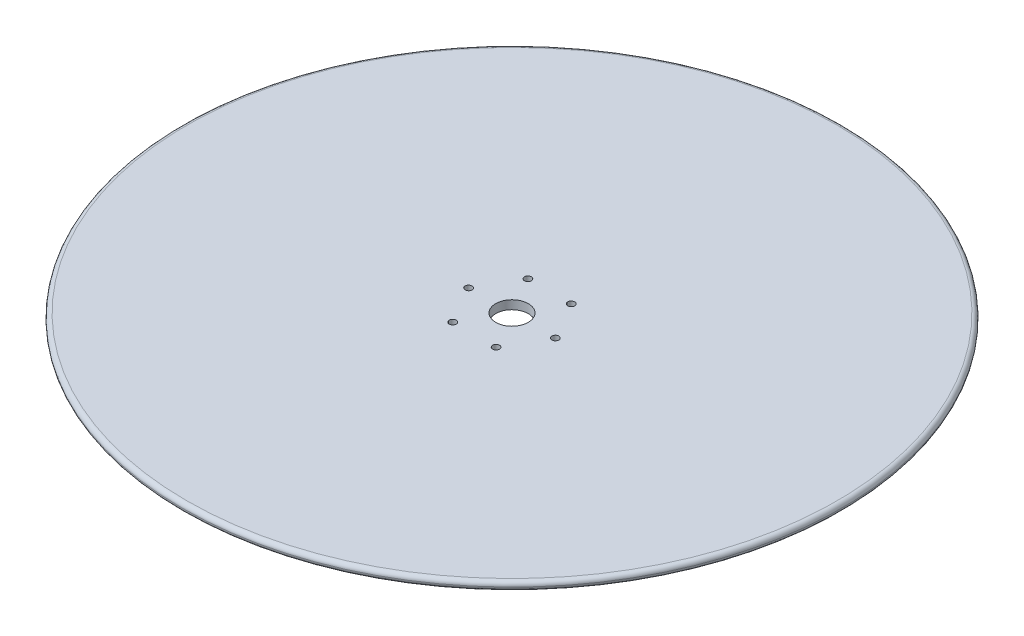
ISO-10303-21;
HEADER;
FILE_DESCRIPTION(('STEP AP214'),'2;1');
FILE_NAME('part.step','',(''),(''),'','','');
FILE_SCHEMA(('AUTOMOTIVE_DESIGN { 1 0 10303 214 1 1 1 1 }'));
ENDSEC;
DATA;
#1=APPLICATION_CONTEXT('core data for automotive mechanical design processes');
#2=APPLICATION_PROTOCOL_DEFINITION('international standard','automotive_design',2000,#1);
#3=PRODUCT_CONTEXT('',#1,'mechanical');
#4=PRODUCT('Part','Part','',(#3));
#5=PRODUCT_RELATED_PRODUCT_CATEGORY('part','',(#4));
#6=PRODUCT_DEFINITION_FORMATION('','',#4);
#7=PRODUCT_DEFINITION_CONTEXT('part definition',#1,'design');
#8=PRODUCT_DEFINITION('design','',#6,#7);
#9=PRODUCT_DEFINITION_SHAPE('','',#8);
#10=(LENGTH_UNIT() NAMED_UNIT(*) SI_UNIT(.MILLI.,.METRE.));
#11=(NAMED_UNIT(*) PLANE_ANGLE_UNIT() SI_UNIT($,.RADIAN.));
#12=(NAMED_UNIT(*) SI_UNIT($,.STERADIAN.) SOLID_ANGLE_UNIT());
#13=UNCERTAINTY_MEASURE_WITH_UNIT(LENGTH_MEASURE(1.E-05),#10,'distance_accuracy_value','');
#14=(GEOMETRIC_REPRESENTATION_CONTEXT(3) GLOBAL_UNCERTAINTY_ASSIGNED_CONTEXT((#13)) GLOBAL_UNIT_ASSIGNED_CONTEXT((#10,
#11,#12)) REPRESENTATION_CONTEXT('',''));
#15=CARTESIAN_POINT('',(0.,0.,0.));
#16=DIRECTION('',(0.,0.,1.));
#17=DIRECTION('',(1.,0.,0.));
#18=AXIS2_PLACEMENT_3D('',#15,#16,#17);
#19=CARTESIAN_POINT('',(0.,10.,0.));
#20=DIRECTION('',(0.,1.,0.));
#21=DIRECTION('',(0.,0.,1.));
#22=AXIS2_PLACEMENT_3D('',#19,#20,#21);
#23=PLANE('',#22);
#24=CARTESIAN_POINT('',(0.,10.,0.));
#25=DIRECTION('',(0.,1.,0.));
#26=DIRECTION('',(0.,0.,1.));
#27=AXIS2_PLACEMENT_3D('',#24,#25,#26);
#28=CIRCLE('',#27,375.);
#29=CARTESIAN_POINT('',(0.,10.,375.));
#30=VERTEX_POINT('',#29);
#31=EDGE_CURVE('E10',#30,#30,#28,.T.);
#32=ORIENTED_EDGE('',*,*,#31,.T.);
#33=EDGE_LOOP('',(#32));
#34=FACE_BOUND('',#33,.T.);
#35=CARTESIAN_POINT('',(24.9999999999995,10.,43.3012701892223));
#36=DIRECTION('',(0.,1.,0.));
#37=DIRECTION('',(0.,0.,1.));
#38=AXIS2_PLACEMENT_3D('',#35,#36,#37);
#39=CIRCLE('',#38,4.00000000000001);
#40=CARTESIAN_POINT('',(24.9999999999995,10.,47.3012701892223));
#41=VERTEX_POINT('',#40);
#42=EDGE_CURVE('E90',#41,#41,#39,.T.);
#43=ORIENTED_EDGE('',*,*,#42,.F.);
#44=EDGE_LOOP('',(#43));
#45=FACE_BOUND('',#44,.T.);
#46=CARTESIAN_POINT('',(50.,10.,4.71844785465692E-13));
#47=DIRECTION('',(0.,1.,0.));
#48=DIRECTION('',(0.,0.,1.));
#49=AXIS2_PLACEMENT_3D('',#46,#47,#48);
#50=CIRCLE('',#49,4.);
#51=CARTESIAN_POINT('',(50.,10.,4.00000000000047));
#52=VERTEX_POINT('',#51);
#53=EDGE_CURVE('E98',#52,#52,#50,.T.);
#54=ORIENTED_EDGE('',*,*,#53,.F.);
#55=EDGE_LOOP('',(#54));
#56=FACE_BOUND('',#55,.T.);
#57=CARTESIAN_POINT('',(25.0000000000003,10.,-43.3012701892218));
#58=DIRECTION('',(0.,1.,0.));
#59=DIRECTION('',(0.,0.,1.));
#60=AXIS2_PLACEMENT_3D('',#57,#58,#59);
#61=CIRCLE('',#60,4.);
#62=CARTESIAN_POINT('',(25.0000000000003,10.,-39.3012701892218));
#63=VERTEX_POINT('',#62);
#64=EDGE_CURVE('E106',#63,#63,#61,.T.);
#65=ORIENTED_EDGE('',*,*,#64,.F.);
#66=EDGE_LOOP('',(#65));
#67=FACE_BOUND('',#66,.T.);
#68=CARTESIAN_POINT('',(-24.9999999999998,10.,-43.3012701892221));
#69=DIRECTION('',(0.,1.,0.));
#70=DIRECTION('',(0.,0.,1.));
#71=AXIS2_PLACEMENT_3D('',#68,#69,#70);
#72=CIRCLE('',#71,3.99999999999999);
#73=CARTESIAN_POINT('',(-24.9999999999998,10.,-39.3012701892221));
#74=VERTEX_POINT('',#73);
#75=EDGE_CURVE('E114',#74,#74,#72,.T.);
#76=ORIENTED_EDGE('',*,*,#75,.F.);
#77=EDGE_LOOP('',(#76));
#78=FACE_BOUND('',#77,.T.);
#79=CARTESIAN_POINT('',(-50.,10.,-1.31838984174237E-13));
#80=DIRECTION('',(0.,1.,0.));
#81=DIRECTION('',(0.,0.,1.));
#82=AXIS2_PLACEMENT_3D('',#79,#80,#81);
#83=CIRCLE('',#82,4.);
#84=CARTESIAN_POINT('',(-50.,10.,3.99999999999987));
#85=VERTEX_POINT('',#84);
#86=EDGE_CURVE('E82',#85,#85,#83,.T.);
#87=ORIENTED_EDGE('',*,*,#86,.F.);
#88=EDGE_LOOP('',(#87));
#89=FACE_BOUND('',#88,.T.);
#90=CARTESIAN_POINT('',(-25.,10.,43.3012701892219));
#91=DIRECTION('',(0.,1.,0.));
#92=DIRECTION('',(0.,0.,1.));
#93=AXIS2_PLACEMENT_3D('',#90,#91,#92);
#94=CIRCLE('',#93,4.);
#95=CARTESIAN_POINT('',(-25.,10.,47.301270189222));
#96=VERTEX_POINT('',#95);
#97=EDGE_CURVE('E78',#96,#96,#94,.T.);
#98=ORIENTED_EDGE('',*,*,#97,.F.);
#99=EDGE_LOOP('',(#98));
#100=FACE_BOUND('',#99,.T.);
#101=CARTESIAN_POINT('',(0.,10.,0.));
#102=DIRECTION('',(0.,1.,0.));
#103=DIRECTION('',(0.,0.,1.));
#104=AXIS2_PLACEMENT_3D('',#101,#102,#103);
#105=CIRCLE('',#104,18.75);
#106=CARTESIAN_POINT('',(0.,10.,18.75));
#107=VERTEX_POINT('',#106);
#108=EDGE_CURVE('E67',#107,#107,#105,.T.);
#109=ORIENTED_EDGE('',*,*,#108,.F.);
#110=EDGE_LOOP('',(#109));
#111=FACE_BOUND('',#110,.T.);
#112=ADVANCED_FACE('F53',(#34,#45,#56,#67,#78,#89,#100,#111),#23,.T.);
#113=CARTESIAN_POINT('',(0.,0.,0.));
#114=DIRECTION('',(0.,1.,0.));
#115=DIRECTION('',(0.,0.,1.));
#116=AXIS2_PLACEMENT_3D('',#113,#114,#115);
#117=PLANE('',#116);
#118=CARTESIAN_POINT('',(0.,0.,0.));
#119=DIRECTION('',(0.,1.,0.));
#120=DIRECTION('',(0.,0.,1.));
#121=AXIS2_PLACEMENT_3D('',#118,#119,#120);
#122=CIRCLE('',#121,375.);
#123=CARTESIAN_POINT('',(0.,0.,375.));
#124=VERTEX_POINT('',#123);
#125=EDGE_CURVE('E62',#124,#124,#122,.F.);
#126=ORIENTED_EDGE('',*,*,#125,.T.);
#127=EDGE_LOOP('',(#126));
#128=FACE_BOUND('',#127,.T.);
#129=CARTESIAN_POINT('',(24.9999999999995,0.,43.3012701892223));
#130=DIRECTION('',(0.,1.,0.));
#131=DIRECTION('',(0.,0.,1.));
#132=AXIS2_PLACEMENT_3D('',#129,#130,#131);
#133=CIRCLE('',#132,4.00000000000001);
#134=CARTESIAN_POINT('',(24.9999999999995,0.,47.3012701892223));
#135=VERTEX_POINT('',#134);
#136=EDGE_CURVE('E86',#135,#135,#133,.T.);
#137=ORIENTED_EDGE('',*,*,#136,.T.);
#138=EDGE_LOOP('',(#137));
#139=FACE_BOUND('',#138,.T.);
#140=CARTESIAN_POINT('',(50.,0.,4.71844785465692E-13));
#141=DIRECTION('',(0.,1.,0.));
#142=DIRECTION('',(0.,0.,1.));
#143=AXIS2_PLACEMENT_3D('',#140,#141,#142);
#144=CIRCLE('',#143,4.);
#145=CARTESIAN_POINT('',(50.,0.,4.00000000000047));
#146=VERTEX_POINT('',#145);
#147=EDGE_CURVE('E94',#146,#146,#144,.T.);
#148=ORIENTED_EDGE('',*,*,#147,.T.);
#149=EDGE_LOOP('',(#148));
#150=FACE_BOUND('',#149,.T.);
#151=CARTESIAN_POINT('',(25.0000000000003,0.,-43.3012701892218));
#152=DIRECTION('',(0.,1.,0.));
#153=DIRECTION('',(0.,0.,1.));
#154=AXIS2_PLACEMENT_3D('',#151,#152,#153);
#155=CIRCLE('',#154,4.);
#156=CARTESIAN_POINT('',(25.0000000000003,0.,-39.3012701892218));
#157=VERTEX_POINT('',#156);
#158=EDGE_CURVE('E102',#157,#157,#155,.T.);
#159=ORIENTED_EDGE('',*,*,#158,.T.);
#160=EDGE_LOOP('',(#159));
#161=FACE_BOUND('',#160,.T.);
#162=CARTESIAN_POINT('',(-24.9999999999998,0.,-43.3012701892221));
#163=DIRECTION('',(0.,1.,0.));
#164=DIRECTION('',(0.,0.,1.));
#165=AXIS2_PLACEMENT_3D('',#162,#163,#164);
#166=CIRCLE('',#165,3.99999999999999);
#167=CARTESIAN_POINT('',(-24.9999999999998,0.,-39.3012701892221));
#168=VERTEX_POINT('',#167);
#169=EDGE_CURVE('E110',#168,#168,#166,.T.);
#170=ORIENTED_EDGE('',*,*,#169,.T.);
#171=EDGE_LOOP('',(#170));
#172=FACE_BOUND('',#171,.T.);
#173=CARTESIAN_POINT('',(-50.,0.,-1.31838984174237E-13));
#174=DIRECTION('',(0.,1.,0.));
#175=DIRECTION('',(0.,0.,1.));
#176=AXIS2_PLACEMENT_3D('',#173,#174,#175);
#177=CIRCLE('',#176,4.);
#178=CARTESIAN_POINT('',(-50.,0.,3.99999999999987));
#179=VERTEX_POINT('',#178);
#180=EDGE_CURVE('E118',#179,#179,#177,.T.);
#181=ORIENTED_EDGE('',*,*,#180,.T.);
#182=EDGE_LOOP('',(#181));
#183=FACE_BOUND('',#182,.T.);
#184=CARTESIAN_POINT('',(-25.,0.,43.3012701892219));
#185=DIRECTION('',(0.,1.,0.));
#186=DIRECTION('',(0.,0.,1.));
#187=AXIS2_PLACEMENT_3D('',#184,#185,#186);
#188=CIRCLE('',#187,4.);
#189=CARTESIAN_POINT('',(-25.,0.,47.301270189222));
#190=VERTEX_POINT('',#189);
#191=EDGE_CURVE('E74',#190,#190,#188,.T.);
#192=ORIENTED_EDGE('',*,*,#191,.T.);
#193=EDGE_LOOP('',(#192));
#194=FACE_BOUND('',#193,.T.);
#195=CARTESIAN_POINT('',(0.,0.,0.));
#196=DIRECTION('',(0.,1.,0.));
#197=DIRECTION('',(0.,0.,1.));
#198=AXIS2_PLACEMENT_3D('',#195,#196,#197);
#199=CIRCLE('',#198,18.75);
#200=CARTESIAN_POINT('',(0.,0.,18.75));
#201=VERTEX_POINT('',#200);
#202=EDGE_CURVE('E70',#201,#201,#199,.T.);
#203=ORIENTED_EDGE('',*,*,#202,.T.);
#204=EDGE_LOOP('',(#203));
#205=FACE_BOUND('',#204,.T.);
#206=ADVANCED_FACE('F130',(#128,#139,#150,#161,#172,#183,#194,#205),#117,.F.);
#207=CARTESIAN_POINT('',(0.,10.,0.));
#208=DIRECTION('',(0.,-1.,0.));
#209=DIRECTION('',(0.,0.,-1.));
#210=AXIS2_PLACEMENT_3D('',#207,#208,#209);
#211=CYLINDRICAL_SURFACE('',#210,18.75);
#212=ORIENTED_EDGE('',*,*,#108,.T.);
#213=EDGE_LOOP('',(#212));
#214=FACE_BOUND('',#213,.T.);
#215=ORIENTED_EDGE('',*,*,#202,.F.);
#216=EDGE_LOOP('',(#215));
#217=FACE_BOUND('',#216,.T.);
#218=ADVANCED_FACE('F136',(#214,#217),#211,.F.);
#219=CARTESIAN_POINT('',(-25.,0.,43.3012701892219));
#220=DIRECTION('',(0.,1.,0.));
#221=DIRECTION('',(0.,0.,1.));
#222=AXIS2_PLACEMENT_3D('',#219,#220,#221);
#223=CYLINDRICAL_SURFACE('',#222,4.);
#224=ORIENTED_EDGE('',*,*,#191,.F.);
#225=EDGE_LOOP('',(#224));
#226=FACE_BOUND('',#225,.T.);
#227=ORIENTED_EDGE('',*,*,#97,.T.);
#228=EDGE_LOOP('',(#227));
#229=FACE_BOUND('',#228,.T.);
#230=ADVANCED_FACE('F139',(#226,#229),#223,.F.);
#231=CARTESIAN_POINT('',(-50.,0.,-1.31838984174237E-13));
#232=DIRECTION('',(0.,1.,0.));
#233=DIRECTION('',(0.,0.,1.));
#234=AXIS2_PLACEMENT_3D('',#231,#232,#233);
#235=CYLINDRICAL_SURFACE('',#234,4.);
#236=ORIENTED_EDGE('',*,*,#180,.F.);
#237=EDGE_LOOP('',(#236));
#238=FACE_BOUND('',#237,.T.);
#239=ORIENTED_EDGE('',*,*,#86,.T.);
#240=EDGE_LOOP('',(#239));
#241=FACE_BOUND('',#240,.T.);
#242=ADVANCED_FACE('F126',(#238,#241),#235,.F.);
#243=CARTESIAN_POINT('',(-24.9999999999998,0.,-43.3012701892221));
#244=DIRECTION('',(0.,1.,0.));
#245=DIRECTION('',(0.,0.,1.));
#246=AXIS2_PLACEMENT_3D('',#243,#244,#245);
#247=CYLINDRICAL_SURFACE('',#246,3.99999999999999);
#248=ORIENTED_EDGE('',*,*,#169,.F.);
#249=EDGE_LOOP('',(#248));
#250=FACE_BOUND('',#249,.T.);
#251=ORIENTED_EDGE('',*,*,#75,.T.);
#252=EDGE_LOOP('',(#251));
#253=FACE_BOUND('',#252,.T.);
#254=ADVANCED_FACE('F185',(#250,#253),#247,.F.);
#255=CARTESIAN_POINT('',(25.0000000000003,0.,-43.3012701892218));
#256=DIRECTION('',(0.,1.,0.));
#257=DIRECTION('',(0.,0.,1.));
#258=AXIS2_PLACEMENT_3D('',#255,#256,#257);
#259=CYLINDRICAL_SURFACE('',#258,4.);
#260=ORIENTED_EDGE('',*,*,#158,.F.);
#261=EDGE_LOOP('',(#260));
#262=FACE_BOUND('',#261,.T.);
#263=ORIENTED_EDGE('',*,*,#64,.T.);
#264=EDGE_LOOP('',(#263));
#265=FACE_BOUND('',#264,.T.);
#266=ADVANCED_FACE('F173',(#262,#265),#259,.F.);
#267=CARTESIAN_POINT('',(50.,0.,4.71844785465692E-13));
#268=DIRECTION('',(0.,1.,0.));
#269=DIRECTION('',(0.,0.,1.));
#270=AXIS2_PLACEMENT_3D('',#267,#268,#269);
#271=CYLINDRICAL_SURFACE('',#270,4.);
#272=ORIENTED_EDGE('',*,*,#147,.F.);
#273=EDGE_LOOP('',(#272));
#274=FACE_BOUND('',#273,.T.);
#275=ORIENTED_EDGE('',*,*,#53,.T.);
#276=EDGE_LOOP('',(#275));
#277=FACE_BOUND('',#276,.T.);
#278=ADVANCED_FACE('F167',(#274,#277),#271,.F.);
#279=CARTESIAN_POINT('',(24.9999999999995,0.,43.3012701892223));
#280=DIRECTION('',(0.,1.,0.));
#281=DIRECTION('',(0.,0.,1.));
#282=AXIS2_PLACEMENT_3D('',#279,#280,#281);
#283=CYLINDRICAL_SURFACE('',#282,4.00000000000001);
#284=ORIENTED_EDGE('',*,*,#136,.F.);
#285=EDGE_LOOP('',(#284));
#286=FACE_BOUND('',#285,.T.);
#287=ORIENTED_EDGE('',*,*,#42,.T.);
#288=EDGE_LOOP('',(#287));
#289=FACE_BOUND('',#288,.T.);
#290=ADVANCED_FACE('F156',(#286,#289),#283,.F.);
#291=CARTESIAN_POINT('',(0.,5.,0.));
#292=DIRECTION('',(0.,1.,0.));
#293=DIRECTION('',(0.,0.,1.));
#294=AXIS2_PLACEMENT_3D('',#291,#292,#293);
#295=TOROIDAL_SURFACE('',#294,375.,5.);
#296=ORIENTED_EDGE('',*,*,#31,.F.);
#297=EDGE_LOOP('',(#296));
#298=FACE_BOUND('',#297,.T.);
#299=CARTESIAN_POINT('',(0.,5.,0.));
#300=DIRECTION('',(0.,1.,0.));
#301=DIRECTION('',(0.,0.,1.));
#302=AXIS2_PLACEMENT_3D('',#299,#300,#301);
#303=CIRCLE('',#302,380.);
#304=CARTESIAN_POINT('',(0.,5.,380.));
#305=VERTEX_POINT('',#304);
#306=EDGE_CURVE('E57',#305,#305,#303,.F.);
#307=ORIENTED_EDGE('',*,*,#306,.F.);
#308=EDGE_LOOP('',(#307));
#309=FACE_BOUND('',#308,.T.);
#310=ADVANCED_FACE('F55',(#298,#309),#295,.T.);
#311=CARTESIAN_POINT('',(0.,5.,0.));
#312=DIRECTION('',(0.,1.,0.));
#313=DIRECTION('',(0.,0.,1.));
#314=AXIS2_PLACEMENT_3D('',#311,#312,#313);
#315=TOROIDAL_SURFACE('',#314,375.,5.);
#316=ORIENTED_EDGE('',*,*,#125,.F.);
#317=EDGE_LOOP('',(#316));
#318=FACE_BOUND('',#317,.T.);
#319=ORIENTED_EDGE('',*,*,#306,.T.);
#320=EDGE_LOOP('',(#319));
#321=FACE_BOUND('',#320,.T.);
#322=ADVANCED_FACE('F151',(#318,#321),#315,.T.);
#323=CLOSED_SHELL('',(#112,#206,#218,#230,#242,#254,#266,#278,#290,#310,#322));
#324=MANIFOLD_SOLID_BREP('B2',#323);
#325=ADVANCED_BREP_SHAPE_REPRESENTATION('',(#18,#324),#14);
#326=SHAPE_DEFINITION_REPRESENTATION(#9,#325);
ENDSEC;
END-ISO-10303-21;
